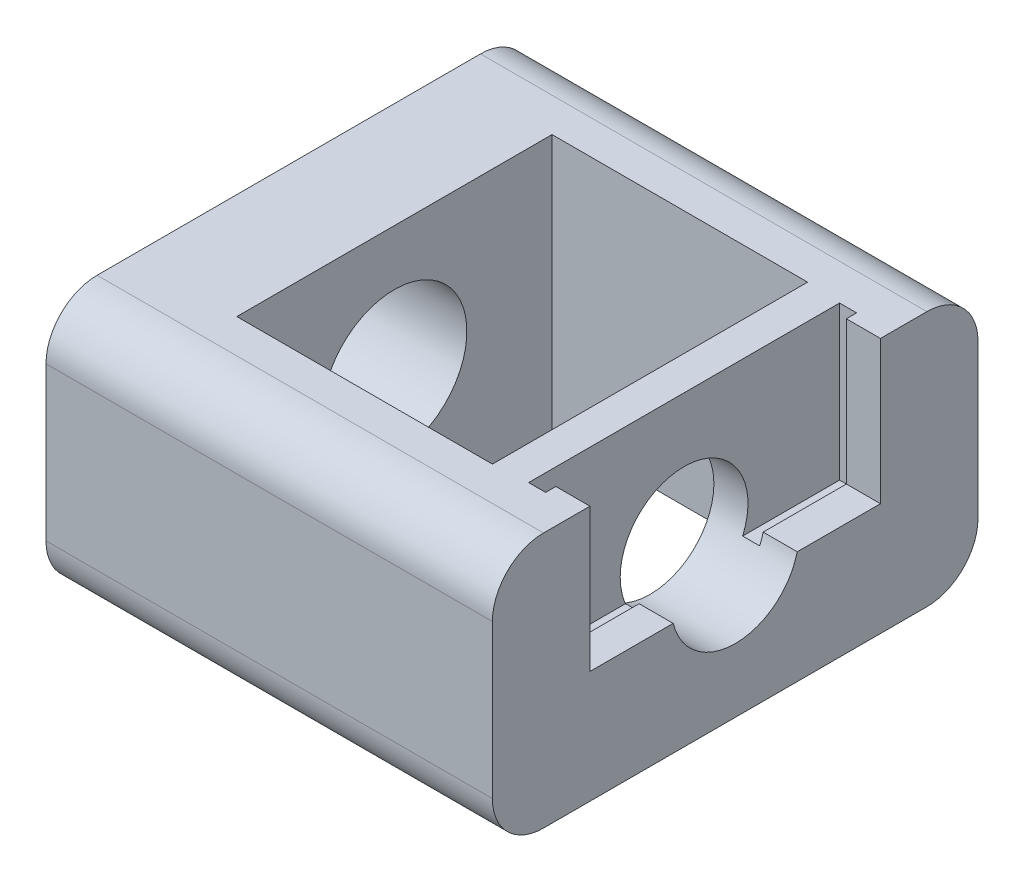
ISO-10303-21;
HEADER;
FILE_DESCRIPTION(('STEP AP214'),'2;1');
FILE_NAME('part.step','',(''),(''),'','','');
FILE_SCHEMA(('AUTOMOTIVE_DESIGN { 1 0 10303 214 1 1 1 1 }'));
ENDSEC;
DATA;
#1=APPLICATION_CONTEXT('core data for automotive mechanical design processes');
#2=APPLICATION_PROTOCOL_DEFINITION('international standard','automotive_design',2000,#1);
#3=PRODUCT_CONTEXT('',#1,'mechanical');
#4=PRODUCT('Part','Part','',(#3));
#5=PRODUCT_RELATED_PRODUCT_CATEGORY('part','',(#4));
#6=PRODUCT_DEFINITION_FORMATION('','',#4);
#7=PRODUCT_DEFINITION_CONTEXT('part definition',#1,'design');
#8=PRODUCT_DEFINITION('design','',#6,#7);
#9=PRODUCT_DEFINITION_SHAPE('','',#8);
#10=(LENGTH_UNIT() NAMED_UNIT(*) SI_UNIT(.MILLI.,.METRE.));
#11=(NAMED_UNIT(*) PLANE_ANGLE_UNIT() SI_UNIT($,.RADIAN.));
#12=(NAMED_UNIT(*) SI_UNIT($,.STERADIAN.) SOLID_ANGLE_UNIT());
#13=UNCERTAINTY_MEASURE_WITH_UNIT(LENGTH_MEASURE(1.E-05),#10,'distance_accuracy_value','');
#14=(GEOMETRIC_REPRESENTATION_CONTEXT(3) GLOBAL_UNCERTAINTY_ASSIGNED_CONTEXT((#13)) GLOBAL_UNIT_ASSIGNED_CONTEXT((#10,
#11,#12)) REPRESENTATION_CONTEXT('',''));
#15=CARTESIAN_POINT('',(0.,0.,0.));
#16=DIRECTION('',(0.,0.,1.));
#17=DIRECTION('',(1.,0.,0.));
#18=AXIS2_PLACEMENT_3D('',#15,#16,#17);
#19=CARTESIAN_POINT('',(24.2,0.,0.));
#20=DIRECTION('',(1.,0.,0.));
#21=DIRECTION('',(0.,0.,-1.));
#22=AXIS2_PLACEMENT_3D('',#19,#20,#21);
#23=PLANE('',#22);
#24=DIRECTION('',(0.,0.,1.));
#25=VECTOR('',#24,1.);
#26=CARTESIAN_POINT('',(24.2,7.5,0.));
#27=LINE('',#26,#25);
#28=CARTESIAN_POINT('',(24.2,7.5,8.525));
#29=VERTEX_POINT('',#28);
#30=CARTESIAN_POINT('',(24.2,7.5,9.125));
#31=VERTEX_POINT('',#30);
#32=EDGE_CURVE('E442',#29,#31,#27,.T.);
#33=ORIENTED_EDGE('',*,*,#32,.F.);
#34=DIRECTION('',(0.,-1.,0.));
#35=VECTOR('',#34,1.);
#36=CARTESIAN_POINT('',(24.2,0.,8.525));
#37=LINE('',#36,#35);
#38=CARTESIAN_POINT('',(24.2,-0.899999999999997,8.525));
#39=VERTEX_POINT('',#38);
#40=EDGE_CURVE('E210',#29,#39,#37,.T.);
#41=ORIENTED_EDGE('',*,*,#40,.T.);
#42=DIRECTION('',(0.,0.,-1.));
#43=VECTOR('',#42,1.);
#44=CARTESIAN_POINT('',(24.2,-0.899999999999997,0.));
#45=LINE('',#44,#43);
#46=CARTESIAN_POINT('',(24.2,-0.899999999999997,3.64039832985348));
#47=VERTEX_POINT('',#46);
#48=EDGE_CURVE('E424',#39,#47,#45,.T.);
#49=ORIENTED_EDGE('',*,*,#48,.T.);
#50=CARTESIAN_POINT('',(24.2,0.,0.));
#51=DIRECTION('',(1.,0.,0.));
#52=DIRECTION('',(0.,0.,-1.));
#53=AXIS2_PLACEMENT_3D('',#50,#51,#52);
#54=CIRCLE('',#53,3.75);
#55=CARTESIAN_POINT('',(24.2,-1.5,3.43693177121688));
#56=VERTEX_POINT('',#55);
#57=EDGE_CURVE('E436',#47,#56,#54,.T.);
#58=ORIENTED_EDGE('',*,*,#57,.T.);
#59=DIRECTION('',(0.,0.,-1.));
#60=VECTOR('',#59,1.);
#61=CARTESIAN_POINT('',(24.2,-1.5,0.));
#62=LINE('',#61,#60);
#63=CARTESIAN_POINT('',(24.2,-1.5,9.125));
#64=VERTEX_POINT('',#63);
#65=EDGE_CURVE('E450',#64,#56,#62,.T.);
#66=ORIENTED_EDGE('',*,*,#65,.F.);
#67=DIRECTION('',(0.,1.,0.));
#68=VECTOR('',#67,1.);
#69=CARTESIAN_POINT('',(24.2,0.,9.125));
#70=LINE('',#69,#68);
#71=EDGE_CURVE('E446',#64,#31,#70,.T.);
#72=ORIENTED_EDGE('',*,*,#71,.T.);
#73=EDGE_LOOP('',(#33,#41,#49,#58,#66,#72));
#74=FACE_BOUND('',#73,.T.);
#75=ADVANCED_FACE('F41',(#74),#23,.F.);
#76=CARTESIAN_POINT('',(6.2,0.,0.));
#77=DIRECTION('',(-1.,0.,0.));
#78=DIRECTION('',(0.,0.,1.));
#79=AXIS2_PLACEMENT_3D('',#76,#77,#78);
#80=PLANE('',#79);
#81=CARTESIAN_POINT('',(6.2,0.,0.));
#82=DIRECTION('',(1.,0.,0.));
#83=DIRECTION('',(0.,0.,-1.));
#84=AXIS2_PLACEMENT_3D('',#81,#82,#83);
#85=CIRCLE('',#84,4.25);
#86=CARTESIAN_POINT('',(6.2,0.,4.25));
#87=VERTEX_POINT('',#86);
#88=EDGE_CURVE('E298',#87,#87,#85,.T.);
#89=ORIENTED_EDGE('',*,*,#88,.F.);
#90=EDGE_LOOP('',(#89));
#91=FACE_BOUND('',#90,.T.);
#92=DIRECTION('',(0.,-1.,0.));
#93=VECTOR('',#92,1.);
#94=CARTESIAN_POINT('',(6.2,7.5,-9.25000000000001));
#95=LINE('',#94,#93);
#96=CARTESIAN_POINT('',(6.2,7.5,-9.25));
#97=VERTEX_POINT('',#96);
#98=CARTESIAN_POINT('',(6.2,-7.5,-9.25));
#99=VERTEX_POINT('',#98);
#100=EDGE_CURVE('E253',#97,#99,#95,.T.);
#101=ORIENTED_EDGE('',*,*,#100,.F.);
#102=DIRECTION('',(0.,0.,1.));
#103=VECTOR('',#102,1.);
#104=CARTESIAN_POINT('',(6.2,7.5,14.25));
#105=LINE('',#104,#103);
#106=CARTESIAN_POINT('',(6.2,7.5,9.25000000000001));
#107=VERTEX_POINT('',#106);
#108=EDGE_CURVE('E306',#97,#107,#105,.T.);
#109=ORIENTED_EDGE('',*,*,#108,.T.);
#110=DIRECTION('',(0.,1.,0.));
#111=VECTOR('',#110,1.);
#112=CARTESIAN_POINT('',(6.2,7.5,9.25000000000001));
#113=LINE('',#112,#111);
#114=CARTESIAN_POINT('',(6.2,-7.5,9.25000000000001));
#115=VERTEX_POINT('',#114);
#116=EDGE_CURVE('E281',#115,#107,#113,.T.);
#117=ORIENTED_EDGE('',*,*,#116,.F.);
#118=DIRECTION('',(0.,0.,-1.));
#119=VECTOR('',#118,1.);
#120=CARTESIAN_POINT('',(6.2,-7.5,14.25));
#121=LINE('',#120,#119);
#122=EDGE_CURVE('E309',#115,#99,#121,.T.);
#123=ORIENTED_EDGE('',*,*,#122,.T.);
#124=EDGE_LOOP('',(#101,#109,#117,#123));
#125=FACE_BOUND('',#124,.T.);
#126=ADVANCED_FACE('F542',(#91,#125),#80,.F.);
#127=CARTESIAN_POINT('',(0.,0.,0.));
#128=DIRECTION('',(-1.,0.,0.));
#129=DIRECTION('',(0.,0.,1.));
#130=AXIS2_PLACEMENT_3D('',#127,#128,#129);
#131=PLANE('',#130);
#132=DIRECTION('',(0.,-1.,0.));
#133=VECTOR('',#132,1.);
#134=CARTESIAN_POINT('',(0.,-7.5,14.25));
#135=LINE('',#134,#133);
#136=CARTESIAN_POINT('',(0.,4.5,14.25));
#137=VERTEX_POINT('',#136);
#138=CARTESIAN_POINT('',(0.,-4.5,14.25));
#139=VERTEX_POINT('',#138);
#140=EDGE_CURVE('E319',#137,#139,#135,.T.);
#141=ORIENTED_EDGE('',*,*,#140,.F.);
#142=CARTESIAN_POINT('',(0.,4.5,11.25));
#143=DIRECTION('',(-1.,0.,0.));
#144=DIRECTION('',(0.,0.,1.));
#145=AXIS2_PLACEMENT_3D('',#142,#143,#144);
#146=CIRCLE('',#145,3.);
#147=CARTESIAN_POINT('',(0.,7.5,11.25));
#148=VERTEX_POINT('',#147);
#149=EDGE_CURVE('E341',#137,#148,#146,.T.);
#150=ORIENTED_EDGE('',*,*,#149,.T.);
#151=DIRECTION('',(0.,0.,1.));
#152=VECTOR('',#151,1.);
#153=CARTESIAN_POINT('',(0.,7.5,14.25));
#154=LINE('',#153,#152);
#155=CARTESIAN_POINT('',(0.,7.5,-11.25));
#156=VERTEX_POINT('',#155);
#157=EDGE_CURVE('E316',#156,#148,#154,.T.);
#158=ORIENTED_EDGE('',*,*,#157,.F.);
#159=CARTESIAN_POINT('',(0.,4.5,-11.25));
#160=DIRECTION('',(-1.,0.,0.));
#161=DIRECTION('',(0.,0.,1.));
#162=AXIS2_PLACEMENT_3D('',#159,#160,#161);
#163=CIRCLE('',#162,3.);
#164=CARTESIAN_POINT('',(0.,4.5,-14.25));
#165=VERTEX_POINT('',#164);
#166=EDGE_CURVE('E335',#156,#165,#163,.T.);
#167=ORIENTED_EDGE('',*,*,#166,.T.);
#168=DIRECTION('',(0.,1.,0.));
#169=VECTOR('',#168,1.);
#170=CARTESIAN_POINT('',(0.,-7.5,-14.25));
#171=LINE('',#170,#169);
#172=CARTESIAN_POINT('',(0.,-4.5,-14.25));
#173=VERTEX_POINT('',#172);
#174=EDGE_CURVE('E302',#173,#165,#171,.T.);
#175=ORIENTED_EDGE('',*,*,#174,.F.);
#176=CARTESIAN_POINT('',(0.,-4.5,-11.25));
#177=DIRECTION('',(-1.,0.,0.));
#178=DIRECTION('',(0.,0.,1.));
#179=AXIS2_PLACEMENT_3D('',#176,#177,#178);
#180=CIRCLE('',#179,3.);
#181=CARTESIAN_POINT('',(0.,-7.5,-11.25));
#182=VERTEX_POINT('',#181);
#183=EDGE_CURVE('E332',#173,#182,#180,.T.);
#184=ORIENTED_EDGE('',*,*,#183,.T.);
#185=DIRECTION('',(0.,0.,-1.));
#186=VECTOR('',#185,1.);
#187=CARTESIAN_POINT('',(0.,-7.5,14.25));
#188=LINE('',#187,#186);
#189=CARTESIAN_POINT('',(0.,-7.5,11.25));
#190=VERTEX_POINT('',#189);
#191=EDGE_CURVE('E310',#190,#182,#188,.T.);
#192=ORIENTED_EDGE('',*,*,#191,.F.);
#193=CARTESIAN_POINT('',(0.,-4.5,11.25));
#194=DIRECTION('',(-1.,0.,0.));
#195=DIRECTION('',(0.,0.,1.));
#196=AXIS2_PLACEMENT_3D('',#193,#194,#195);
#197=CIRCLE('',#196,3.);
#198=EDGE_CURVE('E338',#190,#139,#197,.T.);
#199=ORIENTED_EDGE('',*,*,#198,.T.);
#200=EDGE_LOOP('',(#141,#150,#158,#167,#175,#184,#192,#199));
#201=FACE_BOUND('',#200,.T.);
#202=CARTESIAN_POINT('',(0.,0.,0.));
#203=DIRECTION('',(1.,0.,0.));
#204=DIRECTION('',(0.,0.,-1.));
#205=AXIS2_PLACEMENT_3D('',#202,#203,#204);
#206=CIRCLE('',#205,4.25);
#207=CARTESIAN_POINT('',(0.,0.,4.25));
#208=VERTEX_POINT('',#207);
#209=EDGE_CURVE('E297',#208,#208,#206,.T.);
#210=ORIENTED_EDGE('',*,*,#209,.T.);
#211=EDGE_LOOP('',(#210));
#212=FACE_BOUND('',#211,.T.);
#213=ADVANCED_FACE('F375',(#201,#212),#131,.T.);
#214=CARTESIAN_POINT('',(6.2,-7.5,-14.25));
#215=DIRECTION('',(0.,0.,1.));
#216=DIRECTION('',(1.,0.,0.));
#217=AXIS2_PLACEMENT_3D('',#214,#215,#216);
#218=PLANE('',#217);
#219=ORIENTED_EDGE('',*,*,#174,.T.);
#220=DIRECTION('',(-1.,0.,0.));
#221=VECTOR('',#220,1.);
#222=CARTESIAN_POINT('',(6.2,4.5,-14.25));
#223=LINE('',#222,#221);
#224=CARTESIAN_POINT('',(26.2,4.5,-14.25));
#225=VERTEX_POINT('',#224);
#226=EDGE_CURVE('E11',#165,#225,#223,.F.);
#227=ORIENTED_EDGE('',*,*,#226,.T.);
#228=DIRECTION('',(0.,1.,0.));
#229=VECTOR('',#228,1.);
#230=CARTESIAN_POINT('',(26.2,0.,-14.25));
#231=LINE('',#230,#229);
#232=CARTESIAN_POINT('',(26.2,-4.5,-14.25));
#233=VERTEX_POINT('',#232);
#234=EDGE_CURVE('E233',#233,#225,#231,.T.);
#235=ORIENTED_EDGE('',*,*,#234,.F.);
#236=DIRECTION('',(-1.,0.,0.));
#237=VECTOR('',#236,1.);
#238=CARTESIAN_POINT('',(6.2,-4.5,-14.25));
#239=LINE('',#238,#237);
#240=EDGE_CURVE('E50',#233,#173,#239,.T.);
#241=ORIENTED_EDGE('',*,*,#240,.T.);
#242=EDGE_LOOP('',(#219,#227,#235,#241));
#243=FACE_BOUND('',#242,.T.);
#244=ADVANCED_FACE('F371',(#243),#218,.F.);
#245=CARTESIAN_POINT('',(6.2,7.5,14.25));
#246=DIRECTION('',(0.,-1.,0.));
#247=DIRECTION('',(0.,0.,-1.));
#248=AXIS2_PLACEMENT_3D('',#245,#246,#247);
#249=PLANE('',#248);
#250=ORIENTED_EDGE('',*,*,#157,.T.);
#251=DIRECTION('',(-1.,0.,0.));
#252=VECTOR('',#251,1.);
#253=CARTESIAN_POINT('',(6.2,7.5,11.25));
#254=LINE('',#253,#252);
#255=CARTESIAN_POINT('',(26.2,7.5,11.25));
#256=VERTEX_POINT('',#255);
#257=EDGE_CURVE('E230',#148,#256,#254,.F.);
#258=ORIENTED_EDGE('',*,*,#257,.T.);
#259=DIRECTION('',(0.,0.,1.));
#260=VECTOR('',#259,1.);
#261=CARTESIAN_POINT('',(26.2,7.5,0.));
#262=LINE('',#261,#260);
#263=CARTESIAN_POINT('',(26.2,7.5,8.525));
#264=VERTEX_POINT('',#263);
#265=EDGE_CURVE('E220',#264,#256,#262,.T.);
#266=ORIENTED_EDGE('',*,*,#265,.F.);
#267=DIRECTION('',(-1.,0.,0.));
#268=VECTOR('',#267,1.);
#269=CARTESIAN_POINT('',(26.2,7.5,8.525));
#270=LINE('',#269,#268);
#271=EDGE_CURVE('E203',#264,#29,#270,.T.);
#272=ORIENTED_EDGE('',*,*,#271,.T.);
#273=ORIENTED_EDGE('',*,*,#32,.T.);
#274=DIRECTION('',(-1.,0.,0.));
#275=VECTOR('',#274,1.);
#276=CARTESIAN_POINT('',(24.2,7.5,9.125));
#277=LINE('',#276,#275);
#278=CARTESIAN_POINT('',(23.2,7.5,9.125));
#279=VERTEX_POINT('',#278);
#280=EDGE_CURVE('E481',#31,#279,#277,.T.);
#281=ORIENTED_EDGE('',*,*,#280,.T.);
#282=DIRECTION('',(0.,0.,1.));
#283=VECTOR('',#282,1.);
#284=CARTESIAN_POINT('',(23.2,7.5,0.));
#285=LINE('',#284,#283);
#286=CARTESIAN_POINT('',(23.2,7.5,-9.125));
#287=VERTEX_POINT('',#286);
#288=EDGE_CURVE('E464',#287,#279,#285,.T.);
#289=ORIENTED_EDGE('',*,*,#288,.F.);
#290=DIRECTION('',(-1.,0.,0.));
#291=VECTOR('',#290,1.);
#292=CARTESIAN_POINT('',(24.2,7.5,-9.125));
#293=LINE('',#292,#291);
#294=CARTESIAN_POINT('',(24.2,7.5,-9.125));
#295=VERTEX_POINT('',#294);
#296=EDGE_CURVE('E485',#295,#287,#293,.T.);
#297=ORIENTED_EDGE('',*,*,#296,.F.);
#298=CARTESIAN_POINT('',(24.2,7.5,-8.525));
#299=VERTEX_POINT('',#298);
#300=EDGE_CURVE('E443',#295,#299,#27,.T.);
#301=ORIENTED_EDGE('',*,*,#300,.T.);
#302=DIRECTION('',(-1.,0.,0.));
#303=VECTOR('',#302,1.);
#304=CARTESIAN_POINT('',(26.2,7.5,-8.525));
#305=LINE('',#304,#303);
#306=CARTESIAN_POINT('',(26.2,7.5,-8.525));
#307=VERTEX_POINT('',#306);
#308=EDGE_CURVE('E215',#307,#299,#305,.T.);
#309=ORIENTED_EDGE('',*,*,#308,.F.);
#310=CARTESIAN_POINT('',(26.2,7.5,-11.25));
#311=VERTEX_POINT('',#310);
#312=EDGE_CURVE('E232',#311,#307,#262,.T.);
#313=ORIENTED_EDGE('',*,*,#312,.F.);
#314=DIRECTION('',(-1.,0.,0.));
#315=VECTOR('',#314,1.);
#316=CARTESIAN_POINT('',(6.2,7.5,-11.25));
#317=LINE('',#316,#315);
#318=EDGE_CURVE('E344',#311,#156,#317,.T.);
#319=ORIENTED_EDGE('',*,*,#318,.T.);
#320=EDGE_LOOP('',(#250,#258,#266,#272,#273,#281,#289,#297,#301,#309,#313,#319));
#321=FACE_BOUND('',#320,.T.);
#322=DIRECTION('',(0.,0.,1.));
#323=VECTOR('',#322,1.);
#324=CARTESIAN_POINT('',(21.2,7.5,0.));
#325=LINE('',#324,#323);
#326=CARTESIAN_POINT('',(21.2,7.5,-9.25000000000001));
#327=VERTEX_POINT('',#326);
#328=CARTESIAN_POINT('',(21.2,7.5,9.25000000000001));
#329=VERTEX_POINT('',#328);
#330=EDGE_CURVE('E254',#327,#329,#325,.T.);
#331=ORIENTED_EDGE('',*,*,#330,.T.);
#332=DIRECTION('',(-1.,0.,0.));
#333=VECTOR('',#332,1.);
#334=CARTESIAN_POINT('',(21.2,7.5,9.25000000000001));
#335=LINE('',#334,#333);
#336=EDGE_CURVE('E286',#329,#107,#335,.T.);
#337=ORIENTED_EDGE('',*,*,#336,.T.);
#338=ORIENTED_EDGE('',*,*,#108,.F.);
#339=DIRECTION('',(-1.,0.,0.));
#340=VECTOR('',#339,1.);
#341=CARTESIAN_POINT('',(21.2,7.5,-9.25000000000001));
#342=LINE('',#341,#340);
#343=EDGE_CURVE('E277',#327,#97,#342,.T.);
#344=ORIENTED_EDGE('',*,*,#343,.F.);
#345=EDGE_LOOP('',(#331,#337,#338,#344));
#346=FACE_BOUND('',#345,.T.);
#347=ADVANCED_FACE('F227',(#321,#346),#249,.F.);
#348=CARTESIAN_POINT('',(6.2,-7.5,14.25));
#349=DIRECTION('',(0.,0.,-1.));
#350=DIRECTION('',(-1.,0.,0.));
#351=AXIS2_PLACEMENT_3D('',#348,#349,#350);
#352=PLANE('',#351);
#353=DIRECTION('',(0.,-1.,0.));
#354=VECTOR('',#353,1.);
#355=CARTESIAN_POINT('',(26.2,0.,14.25));
#356=LINE('',#355,#354);
#357=CARTESIAN_POINT('',(26.2,4.5,14.25));
#358=VERTEX_POINT('',#357);
#359=CARTESIAN_POINT('',(26.2,-4.5,14.25));
#360=VERTEX_POINT('',#359);
#361=EDGE_CURVE('E237',#358,#360,#356,.T.);
#362=ORIENTED_EDGE('',*,*,#361,.F.);
#363=DIRECTION('',(-1.,0.,0.));
#364=VECTOR('',#363,1.);
#365=CARTESIAN_POINT('',(6.2,4.5,14.25));
#366=LINE('',#365,#364);
#367=EDGE_CURVE('E328',#358,#137,#366,.T.);
#368=ORIENTED_EDGE('',*,*,#367,.T.);
#369=ORIENTED_EDGE('',*,*,#140,.T.);
#370=DIRECTION('',(-1.,0.,0.));
#371=VECTOR('',#370,1.);
#372=CARTESIAN_POINT('',(6.2,-4.5,14.25));
#373=LINE('',#372,#371);
#374=EDGE_CURVE('E313',#139,#360,#373,.F.);
#375=ORIENTED_EDGE('',*,*,#374,.T.);
#376=EDGE_LOOP('',(#362,#368,#369,#375));
#377=FACE_BOUND('',#376,.T.);
#378=ADVANCED_FACE('F590',(#377),#352,.F.);
#379=CARTESIAN_POINT('',(6.2,-7.5,14.25));
#380=DIRECTION('',(0.,1.,0.));
#381=DIRECTION('',(0.,0.,1.));
#382=AXIS2_PLACEMENT_3D('',#379,#380,#381);
#383=PLANE('',#382);
#384=DIRECTION('',(-1.,0.,0.));
#385=VECTOR('',#384,1.);
#386=CARTESIAN_POINT('',(21.2,-7.5,9.25));
#387=LINE('',#386,#385);
#388=CARTESIAN_POINT('',(21.2,-7.5,9.25));
#389=VERTEX_POINT('',#388);
#390=EDGE_CURVE('E293',#389,#115,#387,.T.);
#391=ORIENTED_EDGE('',*,*,#390,.F.);
#392=DIRECTION('',(0.,0.,1.));
#393=VECTOR('',#392,1.);
#394=CARTESIAN_POINT('',(21.2,-7.5,0.));
#395=LINE('',#394,#393);
#396=CARTESIAN_POINT('',(21.2,-7.5,-9.25));
#397=VERTEX_POINT('',#396);
#398=EDGE_CURVE('E258',#397,#389,#395,.T.);
#399=ORIENTED_EDGE('',*,*,#398,.F.);
#400=DIRECTION('',(-1.,0.,0.));
#401=VECTOR('',#400,1.);
#402=CARTESIAN_POINT('',(21.2,-7.5,-9.25));
#403=LINE('',#402,#401);
#404=EDGE_CURVE('E270',#397,#99,#403,.T.);
#405=ORIENTED_EDGE('',*,*,#404,.T.);
#406=ORIENTED_EDGE('',*,*,#122,.F.);
#407=EDGE_LOOP('',(#391,#399,#405,#406));
#408=FACE_BOUND('',#407,.T.);
#409=DIRECTION('',(0.,0.,1.));
#410=VECTOR('',#409,1.);
#411=CARTESIAN_POINT('',(26.2,-7.5,0.));
#412=LINE('',#411,#410);
#413=CARTESIAN_POINT('',(26.2,-7.5,-11.25));
#414=VERTEX_POINT('',#413);
#415=CARTESIAN_POINT('',(26.2,-7.5,11.25));
#416=VERTEX_POINT('',#415);
#417=EDGE_CURVE('E245',#414,#416,#412,.T.);
#418=ORIENTED_EDGE('',*,*,#417,.T.);
#419=DIRECTION('',(-1.,0.,0.));
#420=VECTOR('',#419,1.);
#421=CARTESIAN_POINT('',(6.2,-7.5,11.25));
#422=LINE('',#421,#420);
#423=EDGE_CURVE('E364',#416,#190,#422,.T.);
#424=ORIENTED_EDGE('',*,*,#423,.T.);
#425=ORIENTED_EDGE('',*,*,#191,.T.);
#426=DIRECTION('',(-1.,0.,0.));
#427=VECTOR('',#426,1.);
#428=CARTESIAN_POINT('',(6.2,-7.5,-11.25));
#429=LINE('',#428,#427);
#430=EDGE_CURVE('E361',#182,#414,#429,.F.);
#431=ORIENTED_EDGE('',*,*,#430,.T.);
#432=EDGE_LOOP('',(#418,#424,#425,#431));
#433=FACE_BOUND('',#432,.T.);
#434=ADVANCED_FACE('F583',(#408,#433),#383,.F.);
#435=CARTESIAN_POINT('',(6.2,0.,0.));
#436=DIRECTION('',(-1.,0.,0.));
#437=DIRECTION('',(0.,0.,1.));
#438=AXIS2_PLACEMENT_3D('',#435,#436,#437);
#439=CYLINDRICAL_SURFACE('',#438,4.25);
#440=CARTESIAN_POINT('',(6.2,0.,4.25));
#441=CARTESIAN_POINT('',(6.13541666666667,0.,4.25));
#442=CARTESIAN_POINT('',(6.07083333333333,0.,4.25));
#443=CARTESIAN_POINT('',(5.94166666666667,0.,4.25));
#444=CARTESIAN_POINT('',(5.87708333333333,0.,4.25));
#445=CARTESIAN_POINT('',(5.74791666666667,0.,4.25));
#446=CARTESIAN_POINT('',(5.68333333333333,0.,4.25));
#447=CARTESIAN_POINT('',(5.55416666666667,0.,4.25));
#448=CARTESIAN_POINT('',(5.48958333333333,0.,4.25));
#449=CARTESIAN_POINT('',(5.36041666666667,0.,4.25));
#450=CARTESIAN_POINT('',(5.29583333333333,0.,4.25));
#451=CARTESIAN_POINT('',(5.16666666666667,0.,4.25));
#452=CARTESIAN_POINT('',(5.10208333333333,0.,4.25));
#453=CARTESIAN_POINT('',(4.97291666666667,0.,4.25));
#454=CARTESIAN_POINT('',(4.90833333333333,0.,4.25));
#455=CARTESIAN_POINT('',(4.77916666666667,0.,4.25));
#456=CARTESIAN_POINT('',(4.71458333333333,0.,4.25));
#457=CARTESIAN_POINT('',(4.58541666666667,0.,4.25));
#458=CARTESIAN_POINT('',(4.52083333333333,0.,4.25));
#459=CARTESIAN_POINT('',(4.39166666666667,0.,4.25));
#460=CARTESIAN_POINT('',(4.32708333333333,0.,4.25));
#461=CARTESIAN_POINT('',(4.19791666666667,0.,4.25));
#462=CARTESIAN_POINT('',(4.13333333333333,0.,4.25));
#463=CARTESIAN_POINT('',(4.00416666666667,0.,4.25));
#464=CARTESIAN_POINT('',(3.93958333333333,0.,4.25));
#465=CARTESIAN_POINT('',(3.81041666666667,0.,4.25));
#466=CARTESIAN_POINT('',(3.74583333333333,0.,4.25));
#467=CARTESIAN_POINT('',(3.61666666666667,0.,4.25));
#468=CARTESIAN_POINT('',(3.55208333333333,0.,4.25));
#469=CARTESIAN_POINT('',(3.42291666666667,0.,4.25));
#470=CARTESIAN_POINT('',(3.35833333333333,0.,4.25));
#471=CARTESIAN_POINT('',(3.22916666666667,0.,4.25));
#472=CARTESIAN_POINT('',(3.16458333333333,0.,4.25));
#473=CARTESIAN_POINT('',(3.03541666666667,0.,4.25));
#474=CARTESIAN_POINT('',(2.97083333333333,0.,4.25));
#475=CARTESIAN_POINT('',(2.84166666666667,0.,4.25));
#476=CARTESIAN_POINT('',(2.77708333333333,0.,4.25));
#477=CARTESIAN_POINT('',(2.64791666666667,0.,4.25));
#478=CARTESIAN_POINT('',(2.58333333333333,0.,4.25));
#479=CARTESIAN_POINT('',(2.45416666666667,0.,4.25));
#480=CARTESIAN_POINT('',(2.38958333333333,0.,4.25));
#481=CARTESIAN_POINT('',(2.26041666666667,0.,4.25));
#482=CARTESIAN_POINT('',(2.19583333333333,0.,4.25));
#483=CARTESIAN_POINT('',(2.06666666666667,0.,4.25));
#484=CARTESIAN_POINT('',(2.00208333333333,0.,4.25));
#485=CARTESIAN_POINT('',(1.87291666666667,0.,4.25));
#486=CARTESIAN_POINT('',(1.80833333333333,0.,4.25));
#487=CARTESIAN_POINT('',(1.67916666666667,0.,4.25));
#488=CARTESIAN_POINT('',(1.61458333333333,0.,4.25));
#489=CARTESIAN_POINT('',(1.48541666666667,0.,4.25));
#490=CARTESIAN_POINT('',(1.42083333333333,0.,4.25));
#491=CARTESIAN_POINT('',(1.29166666666667,0.,4.25));
#492=CARTESIAN_POINT('',(1.22708333333333,0.,4.25));
#493=CARTESIAN_POINT('',(1.09791666666667,0.,4.25));
#494=CARTESIAN_POINT('',(1.03333333333333,0.,4.25));
#495=CARTESIAN_POINT('',(0.904166666666667,0.,4.25));
#496=CARTESIAN_POINT('',(0.839583333333333,0.,4.25));
#497=CARTESIAN_POINT('',(0.710416666666666,0.,4.25));
#498=CARTESIAN_POINT('',(0.645833333333333,0.,4.25));
#499=CARTESIAN_POINT('',(0.516666666666667,0.,4.25));
#500=CARTESIAN_POINT('',(0.452083333333333,0.,4.25));
#501=CARTESIAN_POINT('',(0.322916666666667,0.,4.25));
#502=CARTESIAN_POINT('',(0.258333333333334,0.,4.25));
#503=CARTESIAN_POINT('',(0.129166666666667,0.,4.25));
#504=CARTESIAN_POINT('',(0.0645833333333335,0.,4.25));
#505=CARTESIAN_POINT('',(0.,0.,4.25));
#506=B_SPLINE_CURVE_WITH_KNOTS('',3,(#440,#441,#442,#443,#444,#445,#446,#447,#448,#449,#450,
#451,#452,#453,#454,#455,#456,#457,#458,#459,#460,#461,#462,#463,#464,#465,#466,#467,#468,#469,
#470,#471,#472,#473,#474,#475,#476,#477,#478,#479,#480,#481,#482,#483,#484,#485,#486,#487,#488,
#489,#490,#491,#492,#493,#494,#495,#496,#497,#498,#499,#500,#501,#502,#503,#504,#505),
.UNSPECIFIED.,.F.,.F.,(4,2,2,2,2,2,2,2,2,2,2,2,2,2,2,2,2,2,2,2,2,2,2,2,2,2,2,2,2,2,2,2,4),(0.,
0.19375,0.387500000000001,0.58125,0.775,0.96875,1.1625,1.35625,1.55,1.74375,1.9375,2.13125,
2.325,2.51875,2.7125,2.90625,3.1,3.29375,3.4875,3.68125,3.875,4.06875,4.2625,4.45625,4.65,
4.84375,5.0375,5.23125,5.425,5.61875,5.8125,6.00625,6.2),.UNSPECIFIED.);
#507=EDGE_CURVE('BSEAM580',#87,#208,#506,.T.);
#508=ORIENTED_EDGE('',*,*,#88,.T.);
#509=ORIENTED_EDGE('',*,*,#209,.F.);
#510=ORIENTED_EDGE('',*,*,#507,.T.);
#511=ORIENTED_EDGE('',*,*,#507,.F.);
#512=EDGE_LOOP('',(#508,#510,#509,#511));
#513=FACE_BOUND('',#512,.T.);
#514=ADVANCED_FACE('F580',(#513),#439,.F.);
#515=CARTESIAN_POINT('',(21.2,7.5,9.25000000000001));
#516=DIRECTION('',(0.,0.,1.));
#517=DIRECTION('',(0.,-1.,0.));
#518=AXIS2_PLACEMENT_3D('',#515,#516,#517);
#519=PLANE('',#518);
#520=ORIENTED_EDGE('',*,*,#116,.T.);
#521=ORIENTED_EDGE('',*,*,#336,.F.);
#522=DIRECTION('',(0.,1.,0.));
#523=VECTOR('',#522,1.);
#524=CARTESIAN_POINT('',(21.2,7.5,9.25000000000001));
#525=LINE('',#524,#523);
#526=EDGE_CURVE('E282',#389,#329,#525,.T.);
#527=ORIENTED_EDGE('',*,*,#526,.F.);
#528=ORIENTED_EDGE('',*,*,#390,.T.);
#529=EDGE_LOOP('',(#520,#521,#527,#528));
#530=FACE_BOUND('',#529,.T.);
#531=ADVANCED_FACE('F576',(#530),#519,.F.);
#532=CARTESIAN_POINT('',(21.2,7.5,-9.25000000000001));
#533=DIRECTION('',(0.,0.,-1.));
#534=DIRECTION('',(0.,1.,0.));
#535=AXIS2_PLACEMENT_3D('',#532,#533,#534);
#536=PLANE('',#535);
#537=ORIENTED_EDGE('',*,*,#100,.T.);
#538=ORIENTED_EDGE('',*,*,#404,.F.);
#539=DIRECTION('',(0.,-1.,0.));
#540=VECTOR('',#539,1.);
#541=CARTESIAN_POINT('',(21.2,7.5,-9.25000000000001));
#542=LINE('',#541,#540);
#543=EDGE_CURVE('E266',#327,#397,#542,.T.);
#544=ORIENTED_EDGE('',*,*,#543,.F.);
#545=ORIENTED_EDGE('',*,*,#343,.T.);
#546=EDGE_LOOP('',(#537,#538,#544,#545));
#547=FACE_BOUND('',#546,.T.);
#548=ADVANCED_FACE('F570',(#547),#536,.F.);
#549=CARTESIAN_POINT('',(21.2,0.,0.));
#550=DIRECTION('',(1.,0.,0.));
#551=DIRECTION('',(0.,0.,-1.));
#552=AXIS2_PLACEMENT_3D('',#549,#550,#551);
#553=PLANE('',#552);
#554=CARTESIAN_POINT('',(21.2,0.,0.));
#555=DIRECTION('',(1.,0.,0.));
#556=DIRECTION('',(0.,0.,-1.));
#557=AXIS2_PLACEMENT_3D('',#554,#555,#556);
#558=CIRCLE('',#557,3.75);
#559=CARTESIAN_POINT('',(21.2,0.,-3.75));
#560=VERTEX_POINT('',#559);
#561=EDGE_CURVE('E238',#560,#560,#558,.T.);
#562=ORIENTED_EDGE('',*,*,#561,.T.);
#563=EDGE_LOOP('',(#562));
#564=FACE_BOUND('',#563,.T.);
#565=ORIENTED_EDGE('',*,*,#398,.T.);
#566=ORIENTED_EDGE('',*,*,#526,.T.);
#567=ORIENTED_EDGE('',*,*,#330,.F.);
#568=ORIENTED_EDGE('',*,*,#543,.T.);
#569=EDGE_LOOP('',(#565,#566,#567,#568));
#570=FACE_BOUND('',#569,.T.);
#571=ADVANCED_FACE('F567',(#564,#570),#553,.F.);
#572=CARTESIAN_POINT('',(26.2,0.,0.));
#573=DIRECTION('',(-1.,0.,0.));
#574=DIRECTION('',(0.,0.,1.));
#575=AXIS2_PLACEMENT_3D('',#572,#573,#574);
#576=CYLINDRICAL_SURFACE('',#575,3.75);
#577=DIRECTION('',(-1.,0.,0.));
#578=VECTOR('',#577,1.);
#579=CARTESIAN_POINT('',(26.2,-0.899999999999997,3.64039832985348));
#580=LINE('',#579,#578);
#581=CARTESIAN_POINT('',(26.2,-0.899999999999997,3.64039832985348));
#582=VERTEX_POINT('',#581);
#583=EDGE_CURVE('E407',#582,#47,#580,.T.);
#584=ORIENTED_EDGE('',*,*,#583,.F.);
#585=CARTESIAN_POINT('',(26.2,0.,0.));
#586=DIRECTION('',(1.,0.,0.));
#587=DIRECTION('',(0.,0.,-1.));
#588=AXIS2_PLACEMENT_3D('',#585,#586,#587);
#589=CIRCLE('',#588,3.75);
#590=CARTESIAN_POINT('',(26.2,-0.899999999999998,-3.64039832985348));
#591=VERTEX_POINT('',#590);
#592=EDGE_CURVE('E249',#582,#591,#589,.T.);
#593=ORIENTED_EDGE('',*,*,#592,.T.);
#594=DIRECTION('',(-1.,0.,0.));
#595=VECTOR('',#594,1.);
#596=CARTESIAN_POINT('',(26.2,-0.899999999999998,-3.64039832985348));
#597=LINE('',#596,#595);
#598=CARTESIAN_POINT('',(24.2,-0.899999999999998,-3.64039832985348));
#599=VERTEX_POINT('',#598);
#600=EDGE_CURVE('E410',#591,#599,#597,.T.);
#601=ORIENTED_EDGE('',*,*,#600,.T.);
#602=CARTESIAN_POINT('',(24.2,-1.5,-3.43693177121688));
#603=VERTEX_POINT('',#602);
#604=EDGE_CURVE('E431',#603,#599,#54,.T.);
#605=ORIENTED_EDGE('',*,*,#604,.F.);
#606=DIRECTION('',(-1.,0.,0.));
#607=VECTOR('',#606,1.);
#608=CARTESIAN_POINT('',(24.2,-1.5,-3.43693177121688));
#609=LINE('',#608,#607);
#610=CARTESIAN_POINT('',(23.2,-1.5,-3.43693177121688));
#611=VERTEX_POINT('',#610);
#612=EDGE_CURVE('E259',#603,#611,#609,.T.);
#613=ORIENTED_EDGE('',*,*,#612,.T.);
#614=CARTESIAN_POINT('',(23.2,0.,0.));
#615=DIRECTION('',(1.,0.,0.));
#616=DIRECTION('',(0.,0.,-1.));
#617=AXIS2_PLACEMENT_3D('',#614,#615,#616);
#618=CIRCLE('',#617,3.75);
#619=CARTESIAN_POINT('',(23.2,-1.5,3.43693177121688));
#620=VERTEX_POINT('',#619);
#621=EDGE_CURVE('E430',#611,#620,#618,.T.);
#622=ORIENTED_EDGE('',*,*,#621,.T.);
#623=DIRECTION('',(-1.,0.,0.));
#624=VECTOR('',#623,1.);
#625=CARTESIAN_POINT('',(24.2,-1.5,3.43693177121688));
#626=LINE('',#625,#624);
#627=EDGE_CURVE('E454',#56,#620,#626,.T.);
#628=ORIENTED_EDGE('',*,*,#627,.F.);
#629=ORIENTED_EDGE('',*,*,#57,.F.);
#630=EDGE_LOOP('',(#584,#593,#601,#605,#613,#622,#628,#629));
#631=FACE_BOUND('',#630,.T.);
#632=ORIENTED_EDGE('',*,*,#561,.F.);
#633=EDGE_LOOP('',(#632));
#634=FACE_BOUND('',#633,.T.);
#635=ADVANCED_FACE('F496',(#631,#634),#576,.F.);
#636=CARTESIAN_POINT('',(26.2,0.,0.));
#637=DIRECTION('',(1.,0.,0.));
#638=DIRECTION('',(0.,0.,-1.));
#639=AXIS2_PLACEMENT_3D('',#636,#637,#638);
#640=PLANE('',#639);
#641=ORIENTED_EDGE('',*,*,#265,.T.);
#642=CARTESIAN_POINT('',(26.2,4.5,11.25));
#643=DIRECTION('',(1.,0.,0.));
#644=DIRECTION('',(0.,0.,-1.));
#645=AXIS2_PLACEMENT_3D('',#642,#643,#644);
#646=CIRCLE('',#645,3.);
#647=EDGE_CURVE('E358',#256,#358,#646,.T.);
#648=ORIENTED_EDGE('',*,*,#647,.T.);
#649=ORIENTED_EDGE('',*,*,#361,.T.);
#650=CARTESIAN_POINT('',(26.2,-4.5,11.25));
#651=DIRECTION('',(1.,0.,0.));
#652=DIRECTION('',(0.,0.,-1.));
#653=AXIS2_PLACEMENT_3D('',#650,#651,#652);
#654=CIRCLE('',#653,3.);
#655=EDGE_CURVE('E355',#360,#416,#654,.T.);
#656=ORIENTED_EDGE('',*,*,#655,.T.);
#657=ORIENTED_EDGE('',*,*,#417,.F.);
#658=CARTESIAN_POINT('',(26.2,-4.5,-11.25));
#659=DIRECTION('',(1.,0.,0.));
#660=DIRECTION('',(0.,0.,-1.));
#661=AXIS2_PLACEMENT_3D('',#658,#659,#660);
#662=CIRCLE('',#661,3.);
#663=EDGE_CURVE('E62',#414,#233,#662,.T.);
#664=ORIENTED_EDGE('',*,*,#663,.T.);
#665=ORIENTED_EDGE('',*,*,#234,.T.);
#666=CARTESIAN_POINT('',(26.2,4.5,-11.25));
#667=DIRECTION('',(1.,0.,0.));
#668=DIRECTION('',(0.,0.,-1.));
#669=AXIS2_PLACEMENT_3D('',#666,#667,#668);
#670=CIRCLE('',#669,3.);
#671=EDGE_CURVE('E352',#225,#311,#670,.T.);
#672=ORIENTED_EDGE('',*,*,#671,.T.);
#673=ORIENTED_EDGE('',*,*,#312,.T.);
#674=DIRECTION('',(0.,-1.,0.));
#675=VECTOR('',#674,1.);
#676=CARTESIAN_POINT('',(26.2,0.,-8.525));
#677=LINE('',#676,#675);
#678=CARTESIAN_POINT('',(26.2,-0.899999999999997,-8.525));
#679=VERTEX_POINT('',#678);
#680=EDGE_CURVE('E224',#307,#679,#677,.T.);
#681=ORIENTED_EDGE('',*,*,#680,.T.);
#682=DIRECTION('',(0.,0.,1.));
#683=VECTOR('',#682,1.);
#684=CARTESIAN_POINT('',(26.2,-0.899999999999997,0.));
#685=LINE('',#684,#683);
#686=EDGE_CURVE('E396',#679,#591,#685,.T.);
#687=ORIENTED_EDGE('',*,*,#686,.T.);
#688=ORIENTED_EDGE('',*,*,#592,.F.);
#689=DIRECTION('',(0.,0.,1.));
#690=VECTOR('',#689,1.);
#691=CARTESIAN_POINT('',(26.2,-0.899999999999997,0.));
#692=LINE('',#691,#690);
#693=CARTESIAN_POINT('',(26.2,-0.899999999999997,8.525));
#694=VERTEX_POINT('',#693);
#695=EDGE_CURVE('E216',#582,#694,#692,.T.);
#696=ORIENTED_EDGE('',*,*,#695,.T.);
#697=DIRECTION('',(0.,1.,0.));
#698=VECTOR('',#697,1.);
#699=CARTESIAN_POINT('',(26.2,0.,8.525));
#700=LINE('',#699,#698);
#701=EDGE_CURVE('E207',#694,#264,#700,.T.);
#702=ORIENTED_EDGE('',*,*,#701,.T.);
#703=EDGE_LOOP('',(#641,#648,#649,#656,#657,#664,#665,#672,#673,#681,#687,#688,#696,#702));
#704=FACE_BOUND('',#703,.T.);
#705=ADVANCED_FACE('F219',(#704),#640,.T.);
#706=CARTESIAN_POINT('',(24.2,-1.5,0.));
#707=DIRECTION('',(0.,1.,0.));
#708=DIRECTION('',(0.,0.,1.));
#709=AXIS2_PLACEMENT_3D('',#706,#707,#708);
#710=PLANE('',#709);
#711=DIRECTION('',(0.,0.,-1.));
#712=VECTOR('',#711,1.);
#713=CARTESIAN_POINT('',(23.2,-1.5,0.));
#714=LINE('',#713,#712);
#715=CARTESIAN_POINT('',(23.2,-1.5,-9.125));
#716=VERTEX_POINT('',#715);
#717=EDGE_CURVE('E457',#611,#716,#714,.T.);
#718=ORIENTED_EDGE('',*,*,#717,.F.);
#719=ORIENTED_EDGE('',*,*,#612,.F.);
#720=DIRECTION('',(0.,0.,-1.));
#721=VECTOR('',#720,1.);
#722=CARTESIAN_POINT('',(24.2,-1.5,0.));
#723=LINE('',#722,#721);
#724=CARTESIAN_POINT('',(24.2,-1.5,-9.125));
#725=VERTEX_POINT('',#724);
#726=EDGE_CURVE('E435',#603,#725,#723,.T.);
#727=ORIENTED_EDGE('',*,*,#726,.T.);
#728=DIRECTION('',(-1.,0.,0.));
#729=VECTOR('',#728,1.);
#730=CARTESIAN_POINT('',(24.2,-1.5,-9.125));
#731=LINE('',#730,#729);
#732=EDGE_CURVE('E488',#725,#716,#731,.T.);
#733=ORIENTED_EDGE('',*,*,#732,.T.);
#734=EDGE_LOOP('',(#718,#719,#727,#733));
#735=FACE_BOUND('',#734,.T.);
#736=ADVANCED_FACE('F502',(#735),#710,.T.);
#737=CARTESIAN_POINT('',(24.2,0.,-9.125));
#738=DIRECTION('',(0.,0.,1.));
#739=DIRECTION('',(1.,0.,0.));
#740=AXIS2_PLACEMENT_3D('',#737,#738,#739);
#741=PLANE('',#740);
#742=DIRECTION('',(0.,1.,0.));
#743=VECTOR('',#742,1.);
#744=CARTESIAN_POINT('',(23.2,0.,-9.125));
#745=LINE('',#744,#743);
#746=EDGE_CURVE('E460',#716,#287,#745,.T.);
#747=ORIENTED_EDGE('',*,*,#746,.F.);
#748=ORIENTED_EDGE('',*,*,#732,.F.);
#749=DIRECTION('',(0.,1.,0.));
#750=VECTOR('',#749,1.);
#751=CARTESIAN_POINT('',(24.2,0.,-9.125));
#752=LINE('',#751,#750);
#753=EDGE_CURVE('E439',#725,#295,#752,.T.);
#754=ORIENTED_EDGE('',*,*,#753,.T.);
#755=ORIENTED_EDGE('',*,*,#296,.T.);
#756=EDGE_LOOP('',(#747,#748,#754,#755));
#757=FACE_BOUND('',#756,.T.);
#758=ADVANCED_FACE('F511',(#757),#741,.T.);
#759=CARTESIAN_POINT('',(24.2,0.,9.125));
#760=DIRECTION('',(0.,0.,1.));
#761=DIRECTION('',(1.,0.,0.));
#762=AXIS2_PLACEMENT_3D('',#759,#760,#761);
#763=PLANE('',#762);
#764=DIRECTION('',(0.,1.,0.));
#765=VECTOR('',#764,1.);
#766=CARTESIAN_POINT('',(23.2,0.,9.125));
#767=LINE('',#766,#765);
#768=CARTESIAN_POINT('',(23.2,-1.5,9.125));
#769=VERTEX_POINT('',#768);
#770=EDGE_CURVE('E467',#769,#279,#767,.T.);
#771=ORIENTED_EDGE('',*,*,#770,.T.);
#772=ORIENTED_EDGE('',*,*,#280,.F.);
#773=ORIENTED_EDGE('',*,*,#71,.F.);
#774=DIRECTION('',(-1.,0.,0.));
#775=VECTOR('',#774,1.);
#776=CARTESIAN_POINT('',(24.2,-1.5,9.125));
#777=LINE('',#776,#775);
#778=EDGE_CURVE('E478',#64,#769,#777,.T.);
#779=ORIENTED_EDGE('',*,*,#778,.T.);
#780=EDGE_LOOP('',(#771,#772,#773,#779));
#781=FACE_BOUND('',#780,.T.);
#782=ADVANCED_FACE('F519',(#781),#763,.F.);
#783=CARTESIAN_POINT('',(24.2,-1.5,0.));
#784=DIRECTION('',(0.,1.,0.));
#785=DIRECTION('',(0.,0.,1.));
#786=AXIS2_PLACEMENT_3D('',#783,#784,#785);
#787=PLANE('',#786);
#788=DIRECTION('',(0.,0.,-1.));
#789=VECTOR('',#788,1.);
#790=CARTESIAN_POINT('',(23.2,-1.5,0.));
#791=LINE('',#790,#789);
#792=EDGE_CURVE('E471',#769,#620,#791,.T.);
#793=ORIENTED_EDGE('',*,*,#792,.F.);
#794=ORIENTED_EDGE('',*,*,#778,.F.);
#795=ORIENTED_EDGE('',*,*,#65,.T.);
#796=ORIENTED_EDGE('',*,*,#627,.T.);
#797=EDGE_LOOP('',(#793,#794,#795,#796));
#798=FACE_BOUND('',#797,.T.);
#799=ADVANCED_FACE('F525',(#798),#787,.T.);
#800=ORIENTED_EDGE('',*,*,#604,.T.);
#801=DIRECTION('',(0.,0.,-1.));
#802=VECTOR('',#801,1.);
#803=CARTESIAN_POINT('',(24.2,-0.899999999999997,0.));
#804=LINE('',#803,#802);
#805=CARTESIAN_POINT('',(24.2,-0.899999999999997,-8.525));
#806=VERTEX_POINT('',#805);
#807=EDGE_CURVE('E420',#599,#806,#804,.T.);
#808=ORIENTED_EDGE('',*,*,#807,.T.);
#809=DIRECTION('',(0.,1.,0.));
#810=VECTOR('',#809,1.);
#811=CARTESIAN_POINT('',(24.2,0.,-8.525));
#812=LINE('',#811,#810);
#813=EDGE_CURVE('E406',#806,#299,#812,.T.);
#814=ORIENTED_EDGE('',*,*,#813,.T.);
#815=ORIENTED_EDGE('',*,*,#300,.F.);
#816=ORIENTED_EDGE('',*,*,#753,.F.);
#817=ORIENTED_EDGE('',*,*,#726,.F.);
#818=EDGE_LOOP('',(#800,#808,#814,#815,#816,#817));
#819=FACE_BOUND('',#818,.T.);
#820=ADVANCED_FACE('F506',(#819),#23,.F.);
#821=CARTESIAN_POINT('',(23.2,0.,0.));
#822=DIRECTION('',(1.,0.,0.));
#823=DIRECTION('',(0.,0.,-1.));
#824=AXIS2_PLACEMENT_3D('',#821,#822,#823);
#825=PLANE('',#824);
#826=ORIENTED_EDGE('',*,*,#792,.T.);
#827=ORIENTED_EDGE('',*,*,#621,.F.);
#828=ORIENTED_EDGE('',*,*,#717,.T.);
#829=ORIENTED_EDGE('',*,*,#746,.T.);
#830=ORIENTED_EDGE('',*,*,#288,.T.);
#831=ORIENTED_EDGE('',*,*,#770,.F.);
#832=EDGE_LOOP('',(#826,#827,#828,#829,#830,#831));
#833=FACE_BOUND('',#832,.T.);
#834=ADVANCED_FACE('F514',(#833),#825,.T.);
#835=CARTESIAN_POINT('',(26.2,0.,-8.525));
#836=DIRECTION('',(0.,0.,-1.));
#837=DIRECTION('',(-1.,0.,0.));
#838=AXIS2_PLACEMENT_3D('',#835,#836,#837);
#839=PLANE('',#838);
#840=DIRECTION('',(-1.,0.,0.));
#841=VECTOR('',#840,1.);
#842=CARTESIAN_POINT('',(26.2,-0.899999999999997,-8.525));
#843=LINE('',#842,#841);
#844=EDGE_CURVE('E393',#679,#806,#843,.T.);
#845=ORIENTED_EDGE('',*,*,#844,.F.);
#846=ORIENTED_EDGE('',*,*,#680,.F.);
#847=ORIENTED_EDGE('',*,*,#308,.T.);
#848=ORIENTED_EDGE('',*,*,#813,.F.);
#849=EDGE_LOOP('',(#845,#846,#847,#848));
#850=FACE_BOUND('',#849,.T.);
#851=ADVANCED_FACE('F390',(#850),#839,.F.);
#852=CARTESIAN_POINT('',(26.2,-0.899999999999997,0.));
#853=DIRECTION('',(0.,-1.,0.));
#854=DIRECTION('',(0.,0.,-1.));
#855=AXIS2_PLACEMENT_3D('',#852,#853,#854);
#856=PLANE('',#855);
#857=ORIENTED_EDGE('',*,*,#600,.F.);
#858=ORIENTED_EDGE('',*,*,#686,.F.);
#859=ORIENTED_EDGE('',*,*,#844,.T.);
#860=ORIENTED_EDGE('',*,*,#807,.F.);
#861=EDGE_LOOP('',(#857,#858,#859,#860));
#862=FACE_BOUND('',#861,.T.);
#863=ADVANCED_FACE('F530',(#862),#856,.F.);
#864=CARTESIAN_POINT('',(26.2,0.,8.525));
#865=DIRECTION('',(0.,0.,1.));
#866=DIRECTION('',(0.,-1.,0.));
#867=AXIS2_PLACEMENT_3D('',#864,#865,#866);
#868=PLANE('',#867);
#869=ORIENTED_EDGE('',*,*,#271,.F.);
#870=ORIENTED_EDGE('',*,*,#701,.F.);
#871=DIRECTION('',(-1.,0.,0.));
#872=VECTOR('',#871,1.);
#873=CARTESIAN_POINT('',(26.2,-0.899999999999997,8.525));
#874=LINE('',#873,#872);
#875=EDGE_CURVE('E403',#694,#39,#874,.T.);
#876=ORIENTED_EDGE('',*,*,#875,.T.);
#877=ORIENTED_EDGE('',*,*,#40,.F.);
#878=EDGE_LOOP('',(#869,#870,#876,#877));
#879=FACE_BOUND('',#878,.T.);
#880=ADVANCED_FACE('F205',(#879),#868,.F.);
#881=CARTESIAN_POINT('',(26.2,-0.899999999999997,0.));
#882=DIRECTION('',(0.,-1.,0.));
#883=DIRECTION('',(0.,0.,-1.));
#884=AXIS2_PLACEMENT_3D('',#881,#882,#883);
#885=PLANE('',#884);
#886=ORIENTED_EDGE('',*,*,#875,.F.);
#887=ORIENTED_EDGE('',*,*,#695,.F.);
#888=ORIENTED_EDGE('',*,*,#583,.T.);
#889=ORIENTED_EDGE('',*,*,#48,.F.);
#890=EDGE_LOOP('',(#886,#887,#888,#889));
#891=FACE_BOUND('',#890,.T.);
#892=ADVANCED_FACE('F537',(#891),#885,.F.);
#893=CARTESIAN_POINT('',(6.2,4.5,11.25));
#894=DIRECTION('',(-1.,0.,0.));
#895=DIRECTION('',(0.,0.,1.));
#896=AXIS2_PLACEMENT_3D('',#893,#894,#895);
#897=CYLINDRICAL_SURFACE('',#896,3.);
#898=ORIENTED_EDGE('',*,*,#647,.F.);
#899=ORIENTED_EDGE('',*,*,#257,.F.);
#900=ORIENTED_EDGE('',*,*,#149,.F.);
#901=ORIENTED_EDGE('',*,*,#367,.F.);
#902=EDGE_LOOP('',(#898,#899,#900,#901));
#903=FACE_BOUND('',#902,.T.);
#904=ADVANCED_FACE('F599',(#903),#897,.T.);
#905=CARTESIAN_POINT('',(6.2,-4.5,11.25));
#906=DIRECTION('',(-1.,0.,0.));
#907=DIRECTION('',(0.,0.,1.));
#908=AXIS2_PLACEMENT_3D('',#905,#906,#907);
#909=CYLINDRICAL_SURFACE('',#908,3.);
#910=ORIENTED_EDGE('',*,*,#655,.F.);
#911=ORIENTED_EDGE('',*,*,#374,.F.);
#912=ORIENTED_EDGE('',*,*,#198,.F.);
#913=ORIENTED_EDGE('',*,*,#423,.F.);
#914=EDGE_LOOP('',(#910,#911,#912,#913));
#915=FACE_BOUND('',#914,.T.);
#916=ADVANCED_FACE('F602',(#915),#909,.T.);
#917=CARTESIAN_POINT('',(6.2,4.5,-11.25));
#918=DIRECTION('',(-1.,0.,0.));
#919=DIRECTION('',(0.,0.,1.));
#920=AXIS2_PLACEMENT_3D('',#917,#918,#919);
#921=CYLINDRICAL_SURFACE('',#920,3.);
#922=ORIENTED_EDGE('',*,*,#671,.F.);
#923=ORIENTED_EDGE('',*,*,#226,.F.);
#924=ORIENTED_EDGE('',*,*,#166,.F.);
#925=ORIENTED_EDGE('',*,*,#318,.F.);
#926=EDGE_LOOP('',(#922,#923,#924,#925));
#927=FACE_BOUND('',#926,.T.);
#928=ADVANCED_FACE('F382',(#927),#921,.T.);
#929=CARTESIAN_POINT('',(6.2,-4.5,-11.25));
#930=DIRECTION('',(-1.,0.,0.));
#931=DIRECTION('',(0.,0.,1.));
#932=AXIS2_PLACEMENT_3D('',#929,#930,#931);
#933=CYLINDRICAL_SURFACE('',#932,3.);
#934=ORIENTED_EDGE('',*,*,#663,.F.);
#935=ORIENTED_EDGE('',*,*,#430,.F.);
#936=ORIENTED_EDGE('',*,*,#183,.F.);
#937=ORIENTED_EDGE('',*,*,#240,.F.);
#938=EDGE_LOOP('',(#934,#935,#936,#937));
#939=FACE_BOUND('',#938,.T.);
#940=ADVANCED_FACE('F43',(#939),#933,.T.);
#941=CLOSED_SHELL('',(#75,#126,#213,#244,#347,#378,#434,#514,#531,#548,#571,#635,#705,#736,#758,
#782,#799,#820,#834,#851,#863,#880,#892,#904,#916,#928,#940));
#942=MANIFOLD_SOLID_BREP('B2',#941);
#943=ADVANCED_BREP_SHAPE_REPRESENTATION('',(#18,#942),#14);
#944=SHAPE_DEFINITION_REPRESENTATION(#9,#943);
ENDSEC;
END-ISO-10303-21;
